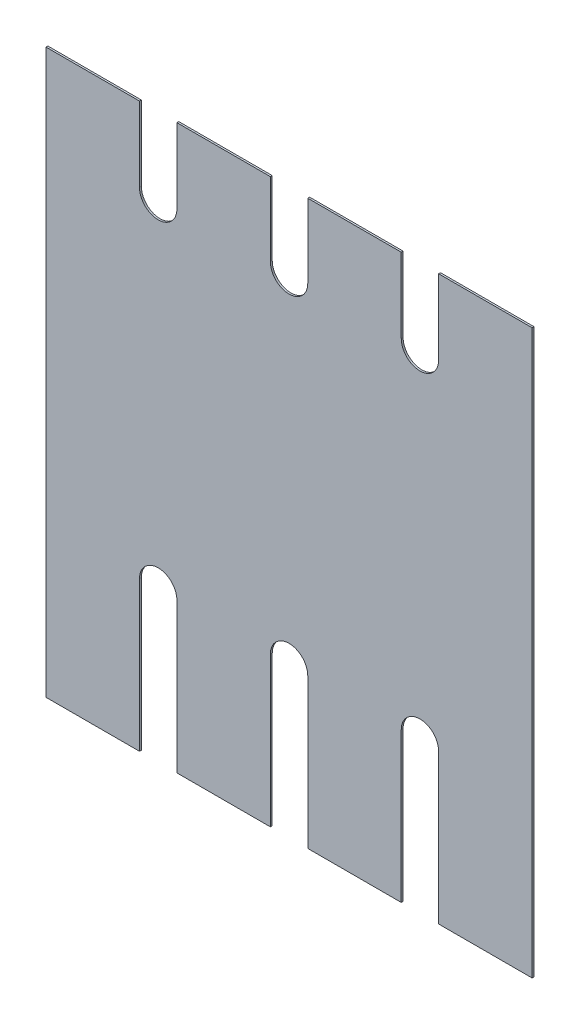
ISO-10303-21;
HEADER;
FILE_DESCRIPTION(('STEP AP214'),'2;1');
FILE_NAME('part.step','',(''),(''),'','','');
FILE_SCHEMA(('AUTOMOTIVE_DESIGN { 1 0 10303 214 1 1 1 1 }'));
ENDSEC;
DATA;
#1=APPLICATION_CONTEXT('core data for automotive mechanical design processes');
#2=APPLICATION_PROTOCOL_DEFINITION('international standard','automotive_design',2000,#1);
#3=PRODUCT_CONTEXT('',#1,'mechanical');
#4=PRODUCT('Part','Part','',(#3));
#5=PRODUCT_RELATED_PRODUCT_CATEGORY('part','',(#4));
#6=PRODUCT_DEFINITION_FORMATION('','',#4);
#7=PRODUCT_DEFINITION_CONTEXT('part definition',#1,'design');
#8=PRODUCT_DEFINITION('design','',#6,#7);
#9=PRODUCT_DEFINITION_SHAPE('','',#8);
#10=(LENGTH_UNIT() NAMED_UNIT(*) SI_UNIT(.MILLI.,.METRE.));
#11=(NAMED_UNIT(*) PLANE_ANGLE_UNIT() SI_UNIT($,.RADIAN.));
#12=(NAMED_UNIT(*) SI_UNIT($,.STERADIAN.) SOLID_ANGLE_UNIT());
#13=UNCERTAINTY_MEASURE_WITH_UNIT(LENGTH_MEASURE(1.E-05),#10,'distance_accuracy_value','');
#14=(GEOMETRIC_REPRESENTATION_CONTEXT(3) GLOBAL_UNCERTAINTY_ASSIGNED_CONTEXT((#13)) GLOBAL_UNIT_ASSIGNED_CONTEXT((#10,
#11,#12)) REPRESENTATION_CONTEXT('',''));
#15=CARTESIAN_POINT('',(0.,0.,0.));
#16=DIRECTION('',(0.,0.,1.));
#17=DIRECTION('',(1.,0.,0.));
#18=AXIS2_PLACEMENT_3D('',#15,#16,#17);
#19=CARTESIAN_POINT('',(1.5,0.,0.025));
#20=DIRECTION('',(-1.,0.,0.));
#21=DIRECTION('',(0.,-1.,0.));
#22=AXIS2_PLACEMENT_3D('',#19,#20,#21);
#23=PLANE('',#22);
#24=DIRECTION('',(0.,1.,0.));
#25=VECTOR('',#24,1.);
#26=CARTESIAN_POINT('',(1.5,0.,0.));
#27=LINE('',#26,#25);
#28=CARTESIAN_POINT('',(1.5,-3.77988348990364,0.));
#29=VERTEX_POINT('',#28);
#30=CARTESIAN_POINT('',(1.5,-1.77988348990364,0.));
#31=VERTEX_POINT('',#30);
#32=EDGE_CURVE('E254',#29,#31,#27,.T.);
#33=ORIENTED_EDGE('',*,*,#32,.T.);
#34=DIRECTION('',(0.,0.,-1.));
#35=VECTOR('',#34,1.);
#36=CARTESIAN_POINT('',(1.5,-1.77988348990364,0.025));
#37=LINE('',#36,#35);
#38=CARTESIAN_POINT('',(1.5,-1.77988348990364,0.025));
#39=VERTEX_POINT('',#38);
#40=EDGE_CURVE('E11',#39,#31,#37,.T.);
#41=ORIENTED_EDGE('',*,*,#40,.F.);
#42=DIRECTION('',(0.,1.,0.));
#43=VECTOR('',#42,1.);
#44=CARTESIAN_POINT('',(1.5,0.,0.025));
#45=LINE('',#44,#43);
#46=CARTESIAN_POINT('',(1.5,-3.77988348990364,0.025));
#47=VERTEX_POINT('',#46);
#48=EDGE_CURVE('E392',#47,#39,#45,.T.);
#49=ORIENTED_EDGE('',*,*,#48,.F.);
#50=DIRECTION('',(0.,0.,-1.));
#51=VECTOR('',#50,1.);
#52=CARTESIAN_POINT('',(1.5,-3.77988348990364,0.025));
#53=LINE('',#52,#51);
#54=EDGE_CURVE('E248',#47,#29,#53,.T.);
#55=ORIENTED_EDGE('',*,*,#54,.T.);
#56=EDGE_LOOP('',(#33,#41,#49,#55));
#57=FACE_BOUND('',#56,.T.);
#58=ADVANCED_FACE('F38',(#57),#23,.F.);
#59=CARTESIAN_POINT('',(1.75,-1.77988348990364,0.025));
#60=DIRECTION('',(0.,0.,-1.));
#61=DIRECTION('',(-1.,0.,0.));
#62=AXIS2_PLACEMENT_3D('',#59,#60,#61);
#63=CYLINDRICAL_SURFACE('',#62,0.249999999999999);
#64=CARTESIAN_POINT('',(1.75,-1.77988348990364,0.));
#65=DIRECTION('',(0.,0.,1.));
#66=DIRECTION('',(1.,0.,0.));
#67=AXIS2_PLACEMENT_3D('',#64,#65,#66);
#68=CIRCLE('',#67,0.249999999999999);
#69=CARTESIAN_POINT('',(2.,-1.77988348990364,0.));
#70=VERTEX_POINT('',#69);
#71=EDGE_CURVE('E257',#31,#70,#68,.F.);
#72=ORIENTED_EDGE('',*,*,#71,.T.);
#73=DIRECTION('',(0.,0.,-1.));
#74=VECTOR('',#73,1.);
#75=CARTESIAN_POINT('',(2.,-1.77988348990364,0.025));
#76=LINE('',#75,#74);
#77=CARTESIAN_POINT('',(2.,-1.77988348990364,0.025));
#78=VERTEX_POINT('',#77);
#79=EDGE_CURVE('E46',#78,#70,#76,.T.);
#80=ORIENTED_EDGE('',*,*,#79,.F.);
#81=CARTESIAN_POINT('',(1.75,-1.77988348990364,0.025));
#82=DIRECTION('',(0.,0.,1.));
#83=DIRECTION('',(1.,0.,0.));
#84=AXIS2_PLACEMENT_3D('',#81,#82,#83);
#85=CIRCLE('',#84,0.249999999999999);
#86=EDGE_CURVE('E153',#39,#78,#85,.F.);
#87=ORIENTED_EDGE('',*,*,#86,.F.);
#88=ORIENTED_EDGE('',*,*,#40,.T.);
#89=EDGE_LOOP('',(#72,#80,#87,#88));
#90=FACE_BOUND('',#89,.T.);
#91=ADVANCED_FACE('F376',(#90),#63,.F.);
#92=CARTESIAN_POINT('',(2.,0.,0.025));
#93=DIRECTION('',(-1.,0.,0.));
#94=DIRECTION('',(0.,-1.,0.));
#95=AXIS2_PLACEMENT_3D('',#92,#93,#94);
#96=PLANE('',#95);
#97=DIRECTION('',(0.,1.,0.));
#98=VECTOR('',#97,1.);
#99=CARTESIAN_POINT('',(2.,0.,0.));
#100=LINE('',#99,#98);
#101=CARTESIAN_POINT('',(2.,-3.77988348990364,0.));
#102=VERTEX_POINT('',#101);
#103=EDGE_CURVE('E260',#102,#70,#100,.T.);
#104=ORIENTED_EDGE('',*,*,#103,.F.);
#105=DIRECTION('',(0.,0.,-1.));
#106=VECTOR('',#105,1.);
#107=CARTESIAN_POINT('',(2.,-3.77988348990364,0.025));
#108=LINE('',#107,#106);
#109=CARTESIAN_POINT('',(2.,-3.77988348990364,0.025));
#110=VERTEX_POINT('',#109);
#111=EDGE_CURVE('E369',#110,#102,#108,.T.);
#112=ORIENTED_EDGE('',*,*,#111,.F.);
#113=DIRECTION('',(0.,1.,0.));
#114=VECTOR('',#113,1.);
#115=CARTESIAN_POINT('',(2.,0.,0.025));
#116=LINE('',#115,#114);
#117=EDGE_CURVE('E375',#110,#78,#116,.T.);
#118=ORIENTED_EDGE('',*,*,#117,.T.);
#119=ORIENTED_EDGE('',*,*,#79,.T.);
#120=EDGE_LOOP('',(#104,#112,#118,#119));
#121=FACE_BOUND('',#120,.T.);
#122=ADVANCED_FACE('F373',(#121),#96,.T.);
#123=CARTESIAN_POINT('',(0.,-3.77988348990364,0.025));
#124=DIRECTION('',(0.,1.,0.));
#125=DIRECTION('',(0.,0.,1.));
#126=AXIS2_PLACEMENT_3D('',#123,#124,#125);
#127=PLANE('',#126);
#128=DIRECTION('',(1.,0.,0.));
#129=VECTOR('',#128,1.);
#130=CARTESIAN_POINT('',(0.,-3.77988348990364,0.));
#131=LINE('',#130,#129);
#132=CARTESIAN_POINT('',(3.25,-3.77988348990364,0.));
#133=VERTEX_POINT('',#132);
#134=EDGE_CURVE('E263',#102,#133,#131,.T.);
#135=ORIENTED_EDGE('',*,*,#134,.T.);
#136=DIRECTION('',(0.,0.,-1.));
#137=VECTOR('',#136,1.);
#138=CARTESIAN_POINT('',(3.25,-3.77988348990364,0.025));
#139=LINE('',#138,#137);
#140=CARTESIAN_POINT('',(3.25,-3.77988348990364,0.025));
#141=VERTEX_POINT('',#140);
#142=EDGE_CURVE('E367',#141,#133,#139,.T.);
#143=ORIENTED_EDGE('',*,*,#142,.F.);
#144=DIRECTION('',(1.,0.,0.));
#145=VECTOR('',#144,1.);
#146=CARTESIAN_POINT('',(0.,-3.77988348990364,0.025));
#147=LINE('',#146,#145);
#148=EDGE_CURVE('E251',#110,#141,#147,.T.);
#149=ORIENTED_EDGE('',*,*,#148,.F.);
#150=ORIENTED_EDGE('',*,*,#111,.T.);
#151=EDGE_LOOP('',(#135,#143,#149,#150));
#152=FACE_BOUND('',#151,.T.);
#153=ADVANCED_FACE('F385',(#152),#127,.F.);
#154=CARTESIAN_POINT('',(3.25,0.,0.025));
#155=DIRECTION('',(1.,0.,0.));
#156=DIRECTION('',(0.,0.,-1.));
#157=AXIS2_PLACEMENT_3D('',#154,#155,#156);
#158=PLANE('',#157);
#159=DIRECTION('',(0.,-1.,0.));
#160=VECTOR('',#159,1.);
#161=CARTESIAN_POINT('',(3.25,0.,0.));
#162=LINE('',#161,#160);
#163=CARTESIAN_POINT('',(3.25,3.75011651009636,0.));
#164=VERTEX_POINT('',#163);
#165=EDGE_CURVE('E266',#164,#133,#162,.T.);
#166=ORIENTED_EDGE('',*,*,#165,.F.);
#167=DIRECTION('',(0.,0.,-1.));
#168=VECTOR('',#167,1.);
#169=CARTESIAN_POINT('',(3.25,3.75011651009636,0.025));
#170=LINE('',#169,#168);
#171=CARTESIAN_POINT('',(3.25,3.75011651009636,0.025));
#172=VERTEX_POINT('',#171);
#173=EDGE_CURVE('E365',#172,#164,#170,.T.);
#174=ORIENTED_EDGE('',*,*,#173,.F.);
#175=DIRECTION('',(0.,-1.,0.));
#176=VECTOR('',#175,1.);
#177=CARTESIAN_POINT('',(3.25,0.,0.025));
#178=LINE('',#177,#176);
#179=EDGE_CURVE('E389',#172,#141,#178,.T.);
#180=ORIENTED_EDGE('',*,*,#179,.T.);
#181=ORIENTED_EDGE('',*,*,#142,.T.);
#182=EDGE_LOOP('',(#166,#174,#180,#181));
#183=FACE_BOUND('',#182,.T.);
#184=ADVANCED_FACE('F477',(#183),#158,.T.);
#185=CARTESIAN_POINT('',(0.,3.75011651009636,0.025));
#186=DIRECTION('',(0.,1.,0.));
#187=DIRECTION('',(0.,0.,1.));
#188=AXIS2_PLACEMENT_3D('',#185,#186,#187);
#189=PLANE('',#188);
#190=DIRECTION('',(1.,0.,0.));
#191=VECTOR('',#190,1.);
#192=CARTESIAN_POINT('',(0.,3.75011651009636,0.));
#193=LINE('',#192,#191);
#194=CARTESIAN_POINT('',(2.,3.75011651009636,0.));
#195=VERTEX_POINT('',#194);
#196=EDGE_CURVE('E270',#195,#164,#193,.T.);
#197=ORIENTED_EDGE('',*,*,#196,.F.);
#198=DIRECTION('',(0.,0.,-1.));
#199=VECTOR('',#198,1.);
#200=CARTESIAN_POINT('',(2.,3.75011651009636,0.025));
#201=LINE('',#200,#199);
#202=CARTESIAN_POINT('',(2.,3.75011651009636,0.025));
#203=VERTEX_POINT('',#202);
#204=EDGE_CURVE('E363',#203,#195,#201,.T.);
#205=ORIENTED_EDGE('',*,*,#204,.F.);
#206=DIRECTION('',(1.,0.,0.));
#207=VECTOR('',#206,1.);
#208=CARTESIAN_POINT('',(0.,3.75011651009636,0.025));
#209=LINE('',#208,#207);
#210=EDGE_CURVE('E397',#203,#172,#209,.T.);
#211=ORIENTED_EDGE('',*,*,#210,.T.);
#212=ORIENTED_EDGE('',*,*,#173,.T.);
#213=EDGE_LOOP('',(#197,#205,#211,#212));
#214=FACE_BOUND('',#213,.T.);
#215=ADVANCED_FACE('F490',(#214),#189,.T.);
#216=CARTESIAN_POINT('',(2.,0.,0.025));
#217=DIRECTION('',(1.,0.,0.));
#218=DIRECTION('',(0.,1.,0.));
#219=AXIS2_PLACEMENT_3D('',#216,#217,#218);
#220=PLANE('',#219);
#221=DIRECTION('',(0.,-1.,0.));
#222=VECTOR('',#221,1.);
#223=CARTESIAN_POINT('',(2.,0.,0.));
#224=LINE('',#223,#222);
#225=CARTESIAN_POINT('',(2.,2.75011651009636,0.));
#226=VERTEX_POINT('',#225);
#227=EDGE_CURVE('E273',#195,#226,#224,.T.);
#228=ORIENTED_EDGE('',*,*,#227,.T.);
#229=DIRECTION('',(0.,0.,-1.));
#230=VECTOR('',#229,1.);
#231=CARTESIAN_POINT('',(2.,2.75011651009636,0.025));
#232=LINE('',#231,#230);
#233=CARTESIAN_POINT('',(2.,2.75011651009636,0.025));
#234=VERTEX_POINT('',#233);
#235=EDGE_CURVE('E360',#234,#226,#232,.T.);
#236=ORIENTED_EDGE('',*,*,#235,.F.);
#237=DIRECTION('',(0.,-1.,0.));
#238=VECTOR('',#237,1.);
#239=CARTESIAN_POINT('',(2.,0.,0.025));
#240=LINE('',#239,#238);
#241=EDGE_CURVE('E400',#203,#234,#240,.T.);
#242=ORIENTED_EDGE('',*,*,#241,.F.);
#243=ORIENTED_EDGE('',*,*,#204,.T.);
#244=EDGE_LOOP('',(#228,#236,#242,#243));
#245=FACE_BOUND('',#244,.T.);
#246=ADVANCED_FACE('F492',(#245),#220,.F.);
#247=CARTESIAN_POINT('',(1.75,2.75011651009636,0.025));
#248=DIRECTION('',(0.,0.,-1.));
#249=DIRECTION('',(-1.,0.,0.));
#250=AXIS2_PLACEMENT_3D('',#247,#248,#249);
#251=CYLINDRICAL_SURFACE('',#250,0.25);
#252=CARTESIAN_POINT('',(1.75,2.75011651009636,0.));
#253=DIRECTION('',(0.,0.,1.));
#254=DIRECTION('',(1.,0.,0.));
#255=AXIS2_PLACEMENT_3D('',#252,#253,#254);
#256=CIRCLE('',#255,0.25);
#257=CARTESIAN_POINT('',(1.5,2.75011651009636,0.));
#258=VERTEX_POINT('',#257);
#259=EDGE_CURVE('E277',#226,#258,#256,.F.);
#260=ORIENTED_EDGE('',*,*,#259,.T.);
#261=DIRECTION('',(0.,0.,-1.));
#262=VECTOR('',#261,1.);
#263=CARTESIAN_POINT('',(1.5,2.75011651009636,0.025));
#264=LINE('',#263,#262);
#265=CARTESIAN_POINT('',(1.5,2.75011651009636,0.025));
#266=VERTEX_POINT('',#265);
#267=EDGE_CURVE('E358',#266,#258,#264,.T.);
#268=ORIENTED_EDGE('',*,*,#267,.F.);
#269=CARTESIAN_POINT('',(1.75,2.75011651009636,0.025));
#270=DIRECTION('',(0.,0.,1.));
#271=DIRECTION('',(1.,0.,0.));
#272=AXIS2_PLACEMENT_3D('',#269,#270,#271);
#273=CIRCLE('',#272,0.25);
#274=EDGE_CURVE('E404',#234,#266,#273,.F.);
#275=ORIENTED_EDGE('',*,*,#274,.F.);
#276=ORIENTED_EDGE('',*,*,#235,.T.);
#277=EDGE_LOOP('',(#260,#268,#275,#276));
#278=FACE_BOUND('',#277,.T.);
#279=ADVANCED_FACE('F495',(#278),#251,.F.);
#280=CARTESIAN_POINT('',(1.5,0.,0.025));
#281=DIRECTION('',(1.,0.,0.));
#282=DIRECTION('',(0.,1.,0.));
#283=AXIS2_PLACEMENT_3D('',#280,#281,#282);
#284=PLANE('',#283);
#285=DIRECTION('',(0.,-1.,0.));
#286=VECTOR('',#285,1.);
#287=CARTESIAN_POINT('',(1.5,0.,0.));
#288=LINE('',#287,#286);
#289=CARTESIAN_POINT('',(1.5,3.75011651009636,0.));
#290=VERTEX_POINT('',#289);
#291=EDGE_CURVE('E280',#290,#258,#288,.T.);
#292=ORIENTED_EDGE('',*,*,#291,.F.);
#293=DIRECTION('',(0.,0.,-1.));
#294=VECTOR('',#293,1.);
#295=CARTESIAN_POINT('',(1.5,3.75011651009636,0.025));
#296=LINE('',#295,#294);
#297=CARTESIAN_POINT('',(1.5,3.75011651009636,0.025));
#298=VERTEX_POINT('',#297);
#299=EDGE_CURVE('E356',#298,#290,#296,.T.);
#300=ORIENTED_EDGE('',*,*,#299,.F.);
#301=DIRECTION('',(0.,-1.,0.));
#302=VECTOR('',#301,1.);
#303=CARTESIAN_POINT('',(1.5,0.,0.025));
#304=LINE('',#303,#302);
#305=EDGE_CURVE('E406',#298,#266,#304,.T.);
#306=ORIENTED_EDGE('',*,*,#305,.T.);
#307=ORIENTED_EDGE('',*,*,#267,.T.);
#308=EDGE_LOOP('',(#292,#300,#306,#307));
#309=FACE_BOUND('',#308,.T.);
#310=ADVANCED_FACE('F499',(#309),#284,.T.);
#311=CARTESIAN_POINT('',(0.25,3.75011651009636,0.));
#312=VERTEX_POINT('',#311);
#313=EDGE_CURVE('E275',#312,#290,#193,.T.);
#314=ORIENTED_EDGE('',*,*,#313,.F.);
#315=DIRECTION('',(0.,0.,-1.));
#316=VECTOR('',#315,1.);
#317=CARTESIAN_POINT('',(0.25,3.75011651009636,0.025));
#318=LINE('',#317,#316);
#319=CARTESIAN_POINT('',(0.25,3.75011651009636,0.025));
#320=VERTEX_POINT('',#319);
#321=EDGE_CURVE('E354',#320,#312,#318,.T.);
#322=ORIENTED_EDGE('',*,*,#321,.F.);
#323=EDGE_CURVE('E402',#320,#298,#209,.T.);
#324=ORIENTED_EDGE('',*,*,#323,.T.);
#325=ORIENTED_EDGE('',*,*,#299,.T.);
#326=EDGE_LOOP('',(#314,#322,#324,#325));
#327=FACE_BOUND('',#326,.T.);
#328=ADVANCED_FACE('F503',(#327),#189,.T.);
#329=CARTESIAN_POINT('',(0.250000000000002,0.,0.025));
#330=DIRECTION('',(1.,0.,0.));
#331=DIRECTION('',(0.,1.,0.));
#332=AXIS2_PLACEMENT_3D('',#329,#330,#331);
#333=PLANE('',#332);
#334=DIRECTION('',(0.,-1.,0.));
#335=VECTOR('',#334,1.);
#336=CARTESIAN_POINT('',(0.250000000000002,0.,0.));
#337=LINE('',#336,#335);
#338=CARTESIAN_POINT('',(0.25,2.765,0.));
#339=VERTEX_POINT('',#338);
#340=EDGE_CURVE('E283',#312,#339,#337,.T.);
#341=ORIENTED_EDGE('',*,*,#340,.T.);
#342=DIRECTION('',(0.,0.,-1.));
#343=VECTOR('',#342,1.);
#344=CARTESIAN_POINT('',(0.25,2.765,0.025));
#345=LINE('',#344,#343);
#346=CARTESIAN_POINT('',(0.25,2.765,0.025));
#347=VERTEX_POINT('',#346);
#348=EDGE_CURVE('E352',#347,#339,#345,.T.);
#349=ORIENTED_EDGE('',*,*,#348,.F.);
#350=DIRECTION('',(0.,-1.,0.));
#351=VECTOR('',#350,1.);
#352=CARTESIAN_POINT('',(0.250000000000002,0.,0.025));
#353=LINE('',#352,#351);
#354=EDGE_CURVE('E409',#320,#347,#353,.T.);
#355=ORIENTED_EDGE('',*,*,#354,.F.);
#356=ORIENTED_EDGE('',*,*,#321,.T.);
#357=EDGE_LOOP('',(#341,#349,#355,#356));
#358=FACE_BOUND('',#357,.T.);
#359=ADVANCED_FACE('F505',(#358),#333,.F.);
#360=CARTESIAN_POINT('',(0.,2.765,0.025));
#361=DIRECTION('',(0.,0.,-1.));
#362=DIRECTION('',(-1.,0.,0.));
#363=AXIS2_PLACEMENT_3D('',#360,#361,#362);
#364=CYLINDRICAL_SURFACE('',#363,0.25);
#365=CARTESIAN_POINT('',(0.,2.765,0.));
#366=DIRECTION('',(0.,0.,1.));
#367=DIRECTION('',(1.,0.,0.));
#368=AXIS2_PLACEMENT_3D('',#365,#366,#367);
#369=CIRCLE('',#368,0.25);
#370=CARTESIAN_POINT('',(-0.25,2.765,0.));
#371=VERTEX_POINT('',#370);
#372=EDGE_CURVE('E286',#371,#339,#369,.T.);
#373=ORIENTED_EDGE('',*,*,#372,.F.);
#374=DIRECTION('',(0.,0.,-1.));
#375=VECTOR('',#374,1.);
#376=CARTESIAN_POINT('',(-0.25,2.765,0.025));
#377=LINE('',#376,#375);
#378=CARTESIAN_POINT('',(-0.25,2.765,0.025));
#379=VERTEX_POINT('',#378);
#380=EDGE_CURVE('E350',#379,#371,#377,.T.);
#381=ORIENTED_EDGE('',*,*,#380,.F.);
#382=CARTESIAN_POINT('',(0.,2.765,0.025));
#383=DIRECTION('',(0.,0.,1.));
#384=DIRECTION('',(1.,0.,0.));
#385=AXIS2_PLACEMENT_3D('',#382,#383,#384);
#386=CIRCLE('',#385,0.25);
#387=EDGE_CURVE('E411',#379,#347,#386,.T.);
#388=ORIENTED_EDGE('',*,*,#387,.T.);
#389=ORIENTED_EDGE('',*,*,#348,.T.);
#390=EDGE_LOOP('',(#373,#381,#388,#389));
#391=FACE_BOUND('',#390,.T.);
#392=ADVANCED_FACE('F508',(#391),#364,.F.);
#393=CARTESIAN_POINT('',(-0.250000000000002,0.,0.025));
#394=DIRECTION('',(1.,0.,0.));
#395=DIRECTION('',(0.,1.,0.));
#396=AXIS2_PLACEMENT_3D('',#393,#394,#395);
#397=PLANE('',#396);
#398=DIRECTION('',(0.,-1.,0.));
#399=VECTOR('',#398,1.);
#400=CARTESIAN_POINT('',(-0.250000000000002,0.,0.));
#401=LINE('',#400,#399);
#402=CARTESIAN_POINT('',(-0.25,3.75011651009636,0.));
#403=VERTEX_POINT('',#402);
#404=EDGE_CURVE('E289',#403,#371,#401,.T.);
#405=ORIENTED_EDGE('',*,*,#404,.F.);
#406=DIRECTION('',(0.,0.,-1.));
#407=VECTOR('',#406,1.);
#408=CARTESIAN_POINT('',(-0.25,3.75011651009636,0.025));
#409=LINE('',#408,#407);
#410=CARTESIAN_POINT('',(-0.25,3.75011651009636,0.025));
#411=VERTEX_POINT('',#410);
#412=EDGE_CURVE('E348',#411,#403,#409,.T.);
#413=ORIENTED_EDGE('',*,*,#412,.F.);
#414=DIRECTION('',(0.,-1.,0.));
#415=VECTOR('',#414,1.);
#416=CARTESIAN_POINT('',(-0.250000000000002,0.,0.025));
#417=LINE('',#416,#415);
#418=EDGE_CURVE('E414',#411,#379,#417,.T.);
#419=ORIENTED_EDGE('',*,*,#418,.T.);
#420=ORIENTED_EDGE('',*,*,#380,.T.);
#421=EDGE_LOOP('',(#405,#413,#419,#420));
#422=FACE_BOUND('',#421,.T.);
#423=ADVANCED_FACE('F512',(#422),#397,.T.);
#424=CARTESIAN_POINT('',(-1.5,3.75011651009636,0.));
#425=VERTEX_POINT('',#424);
#426=EDGE_CURVE('E292',#425,#403,#193,.T.);
#427=ORIENTED_EDGE('',*,*,#426,.F.);
#428=DIRECTION('',(0.,0.,-1.));
#429=VECTOR('',#428,1.);
#430=CARTESIAN_POINT('',(-1.5,3.75011651009636,0.025));
#431=LINE('',#430,#429);
#432=CARTESIAN_POINT('',(-1.5,3.75011651009636,0.025));
#433=VERTEX_POINT('',#432);
#434=EDGE_CURVE('E346',#433,#425,#431,.T.);
#435=ORIENTED_EDGE('',*,*,#434,.F.);
#436=EDGE_CURVE('E417',#433,#411,#209,.T.);
#437=ORIENTED_EDGE('',*,*,#436,.T.);
#438=ORIENTED_EDGE('',*,*,#412,.T.);
#439=EDGE_LOOP('',(#427,#435,#437,#438));
#440=FACE_BOUND('',#439,.T.);
#441=ADVANCED_FACE('F516',(#440),#189,.T.);
#442=CARTESIAN_POINT('',(-1.5,0.,0.025));
#443=DIRECTION('',(1.,0.,0.));
#444=DIRECTION('',(0.,1.,0.));
#445=AXIS2_PLACEMENT_3D('',#442,#443,#444);
#446=PLANE('',#445);
#447=DIRECTION('',(0.,-1.,0.));
#448=VECTOR('',#447,1.);
#449=CARTESIAN_POINT('',(-1.5,0.,0.));
#450=LINE('',#449,#448);
#451=CARTESIAN_POINT('',(-1.5,2.75011651009636,0.));
#452=VERTEX_POINT('',#451);
#453=EDGE_CURVE('E293',#425,#452,#450,.T.);
#454=ORIENTED_EDGE('',*,*,#453,.T.);
#455=DIRECTION('',(0.,0.,-1.));
#456=VECTOR('',#455,1.);
#457=CARTESIAN_POINT('',(-1.5,2.75011651009636,0.025));
#458=LINE('',#457,#456);
#459=CARTESIAN_POINT('',(-1.5,2.75011651009636,0.025));
#460=VERTEX_POINT('',#459);
#461=EDGE_CURVE('E344',#460,#452,#458,.T.);
#462=ORIENTED_EDGE('',*,*,#461,.F.);
#463=DIRECTION('',(0.,-1.,0.));
#464=VECTOR('',#463,1.);
#465=CARTESIAN_POINT('',(-1.5,0.,0.025));
#466=LINE('',#465,#464);
#467=EDGE_CURVE('E418',#433,#460,#466,.T.);
#468=ORIENTED_EDGE('',*,*,#467,.F.);
#469=ORIENTED_EDGE('',*,*,#434,.T.);
#470=EDGE_LOOP('',(#454,#462,#468,#469));
#471=FACE_BOUND('',#470,.T.);
#472=ADVANCED_FACE('F518',(#471),#446,.F.);
#473=CARTESIAN_POINT('',(-1.75,2.75011651009636,0.025));
#474=DIRECTION('',(0.,0.,-1.));
#475=DIRECTION('',(-1.,0.,0.));
#476=AXIS2_PLACEMENT_3D('',#473,#474,#475);
#477=CYLINDRICAL_SURFACE('',#476,0.25);
#478=CARTESIAN_POINT('',(-1.75,2.75011651009636,0.));
#479=DIRECTION('',(0.,0.,1.));
#480=DIRECTION('',(1.,0.,0.));
#481=AXIS2_PLACEMENT_3D('',#478,#479,#480);
#482=CIRCLE('',#481,0.25);
#483=CARTESIAN_POINT('',(-2.,2.75011651009636,0.));
#484=VERTEX_POINT('',#483);
#485=EDGE_CURVE('E296',#484,#452,#482,.T.);
#486=ORIENTED_EDGE('',*,*,#485,.F.);
#487=DIRECTION('',(0.,0.,-1.));
#488=VECTOR('',#487,1.);
#489=CARTESIAN_POINT('',(-2.,2.75011651009636,0.025));
#490=LINE('',#489,#488);
#491=CARTESIAN_POINT('',(-2.,2.75011651009636,0.025));
#492=VERTEX_POINT('',#491);
#493=EDGE_CURVE('E342',#492,#484,#490,.T.);
#494=ORIENTED_EDGE('',*,*,#493,.F.);
#495=CARTESIAN_POINT('',(-1.75,2.75011651009636,0.025));
#496=DIRECTION('',(0.,0.,1.));
#497=DIRECTION('',(1.,0.,0.));
#498=AXIS2_PLACEMENT_3D('',#495,#496,#497);
#499=CIRCLE('',#498,0.25);
#500=EDGE_CURVE('E420',#492,#460,#499,.T.);
#501=ORIENTED_EDGE('',*,*,#500,.T.);
#502=ORIENTED_EDGE('',*,*,#461,.T.);
#503=EDGE_LOOP('',(#486,#494,#501,#502));
#504=FACE_BOUND('',#503,.T.);
#505=ADVANCED_FACE('F521',(#504),#477,.F.);
#506=CARTESIAN_POINT('',(-2.,0.,0.025));
#507=DIRECTION('',(1.,0.,0.));
#508=DIRECTION('',(0.,1.,0.));
#509=AXIS2_PLACEMENT_3D('',#506,#507,#508);
#510=PLANE('',#509);
#511=DIRECTION('',(0.,-1.,0.));
#512=VECTOR('',#511,1.);
#513=CARTESIAN_POINT('',(-2.,0.,0.));
#514=LINE('',#513,#512);
#515=CARTESIAN_POINT('',(-2.,3.75011651009636,0.));
#516=VERTEX_POINT('',#515);
#517=EDGE_CURVE('E299',#516,#484,#514,.T.);
#518=ORIENTED_EDGE('',*,*,#517,.F.);
#519=DIRECTION('',(0.,0.,-1.));
#520=VECTOR('',#519,1.);
#521=CARTESIAN_POINT('',(-2.,3.75011651009636,0.025));
#522=LINE('',#521,#520);
#523=CARTESIAN_POINT('',(-2.,3.75011651009636,0.025));
#524=VERTEX_POINT('',#523);
#525=EDGE_CURVE('E340',#524,#516,#522,.T.);
#526=ORIENTED_EDGE('',*,*,#525,.F.);
#527=DIRECTION('',(0.,-1.,0.));
#528=VECTOR('',#527,1.);
#529=CARTESIAN_POINT('',(-2.,0.,0.025));
#530=LINE('',#529,#528);
#531=EDGE_CURVE('E423',#524,#492,#530,.T.);
#532=ORIENTED_EDGE('',*,*,#531,.T.);
#533=ORIENTED_EDGE('',*,*,#493,.T.);
#534=EDGE_LOOP('',(#518,#526,#532,#533));
#535=FACE_BOUND('',#534,.T.);
#536=ADVANCED_FACE('F525',(#535),#510,.T.);
#537=CARTESIAN_POINT('',(-3.25,3.75011651009636,0.));
#538=VERTEX_POINT('',#537);
#539=EDGE_CURVE('E274',#538,#516,#193,.T.);
#540=ORIENTED_EDGE('',*,*,#539,.F.);
#541=DIRECTION('',(0.,0.,-1.));
#542=VECTOR('',#541,1.);
#543=CARTESIAN_POINT('',(-3.25,3.75011651009636,0.025));
#544=LINE('',#543,#542);
#545=CARTESIAN_POINT('',(-3.25,3.75011651009636,0.025));
#546=VERTEX_POINT('',#545);
#547=EDGE_CURVE('E338',#546,#538,#544,.T.);
#548=ORIENTED_EDGE('',*,*,#547,.F.);
#549=EDGE_CURVE('E401',#546,#524,#209,.T.);
#550=ORIENTED_EDGE('',*,*,#549,.T.);
#551=ORIENTED_EDGE('',*,*,#525,.T.);
#552=EDGE_LOOP('',(#540,#548,#550,#551));
#553=FACE_BOUND('',#552,.T.);
#554=ADVANCED_FACE('F529',(#553),#189,.T.);
#555=CARTESIAN_POINT('',(-3.25,0.,0.025));
#556=DIRECTION('',(1.,0.,0.));
#557=DIRECTION('',(0.,0.,-1.));
#558=AXIS2_PLACEMENT_3D('',#555,#556,#557);
#559=PLANE('',#558);
#560=DIRECTION('',(0.,-1.,0.));
#561=VECTOR('',#560,1.);
#562=CARTESIAN_POINT('',(-3.25,0.,0.));
#563=LINE('',#562,#561);
#564=CARTESIAN_POINT('',(-3.25,-3.77988348990364,0.));
#565=VERTEX_POINT('',#564);
#566=EDGE_CURVE('E302',#538,#565,#563,.T.);
#567=ORIENTED_EDGE('',*,*,#566,.T.);
#568=DIRECTION('',(0.,0.,-1.));
#569=VECTOR('',#568,1.);
#570=CARTESIAN_POINT('',(-3.25,-3.77988348990364,0.025));
#571=LINE('',#570,#569);
#572=CARTESIAN_POINT('',(-3.25,-3.77988348990364,0.025));
#573=VERTEX_POINT('',#572);
#574=EDGE_CURVE('E335',#573,#565,#571,.T.);
#575=ORIENTED_EDGE('',*,*,#574,.F.);
#576=DIRECTION('',(0.,-1.,0.));
#577=VECTOR('',#576,1.);
#578=CARTESIAN_POINT('',(-3.25,0.,0.025));
#579=LINE('',#578,#577);
#580=EDGE_CURVE('E426',#546,#573,#579,.T.);
#581=ORIENTED_EDGE('',*,*,#580,.F.);
#582=ORIENTED_EDGE('',*,*,#547,.T.);
#583=EDGE_LOOP('',(#567,#575,#581,#582));
#584=FACE_BOUND('',#583,.T.);
#585=ADVANCED_FACE('F533',(#584),#559,.F.);
#586=CARTESIAN_POINT('',(-2.,-3.77988348990364,0.));
#587=VERTEX_POINT('',#586);
#588=EDGE_CURVE('E267',#565,#587,#131,.T.);
#589=ORIENTED_EDGE('',*,*,#588,.T.);
#590=DIRECTION('',(0.,0.,-1.));
#591=VECTOR('',#590,1.);
#592=CARTESIAN_POINT('',(-2.,-3.77988348990364,0.025));
#593=LINE('',#592,#591);
#594=CARTESIAN_POINT('',(-2.,-3.77988348990364,0.025));
#595=VERTEX_POINT('',#594);
#596=EDGE_CURVE('E332',#595,#587,#593,.T.);
#597=ORIENTED_EDGE('',*,*,#596,.F.);
#598=EDGE_CURVE('E390',#573,#595,#147,.T.);
#599=ORIENTED_EDGE('',*,*,#598,.F.);
#600=ORIENTED_EDGE('',*,*,#574,.T.);
#601=EDGE_LOOP('',(#589,#597,#599,#600));
#602=FACE_BOUND('',#601,.T.);
#603=ADVANCED_FACE('F447',(#602),#127,.F.);
#604=CARTESIAN_POINT('',(-2.,0.,0.025));
#605=DIRECTION('',(-1.,0.,0.));
#606=DIRECTION('',(0.,-1.,0.));
#607=AXIS2_PLACEMENT_3D('',#604,#605,#606);
#608=PLANE('',#607);
#609=DIRECTION('',(0.,1.,0.));
#610=VECTOR('',#609,1.);
#611=CARTESIAN_POINT('',(-2.,0.,0.));
#612=LINE('',#611,#610);
#613=CARTESIAN_POINT('',(-2.,-1.77988348990364,0.));
#614=VERTEX_POINT('',#613);
#615=EDGE_CURVE('E304',#587,#614,#612,.T.);
#616=ORIENTED_EDGE('',*,*,#615,.T.);
#617=DIRECTION('',(0.,0.,-1.));
#618=VECTOR('',#617,1.);
#619=CARTESIAN_POINT('',(-2.,-1.77988348990364,0.025));
#620=LINE('',#619,#618);
#621=CARTESIAN_POINT('',(-2.,-1.77988348990364,0.025));
#622=VERTEX_POINT('',#621);
#623=EDGE_CURVE('E330',#622,#614,#620,.T.);
#624=ORIENTED_EDGE('',*,*,#623,.F.);
#625=DIRECTION('',(0.,1.,0.));
#626=VECTOR('',#625,1.);
#627=CARTESIAN_POINT('',(-2.,0.,0.025));
#628=LINE('',#627,#626);
#629=EDGE_CURVE('E428',#595,#622,#628,.T.);
#630=ORIENTED_EDGE('',*,*,#629,.F.);
#631=ORIENTED_EDGE('',*,*,#596,.T.);
#632=EDGE_LOOP('',(#616,#624,#630,#631));
#633=FACE_BOUND('',#632,.T.);
#634=ADVANCED_FACE('F451',(#633),#608,.F.);
#635=CARTESIAN_POINT('',(-1.75,-1.77988348990364,0.025));
#636=DIRECTION('',(0.,0.,-1.));
#637=DIRECTION('',(-1.,0.,0.));
#638=AXIS2_PLACEMENT_3D('',#635,#636,#637);
#639=CYLINDRICAL_SURFACE('',#638,0.249999999999999);
#640=CARTESIAN_POINT('',(-1.75,-1.77988348990364,0.));
#641=DIRECTION('',(0.,0.,1.));
#642=DIRECTION('',(1.,0.,0.));
#643=AXIS2_PLACEMENT_3D('',#640,#641,#642);
#644=CIRCLE('',#643,0.249999999999999);
#645=CARTESIAN_POINT('',(-1.5,-1.77988348990364,0.));
#646=VERTEX_POINT('',#645);
#647=EDGE_CURVE('E307',#646,#614,#644,.T.);
#648=ORIENTED_EDGE('',*,*,#647,.F.);
#649=DIRECTION('',(0.,0.,-1.));
#650=VECTOR('',#649,1.);
#651=CARTESIAN_POINT('',(-1.5,-1.77988348990364,0.025));
#652=LINE('',#651,#650);
#653=CARTESIAN_POINT('',(-1.5,-1.77988348990364,0.025));
#654=VERTEX_POINT('',#653);
#655=EDGE_CURVE('E328',#654,#646,#652,.T.);
#656=ORIENTED_EDGE('',*,*,#655,.F.);
#657=CARTESIAN_POINT('',(-1.75,-1.77988348990364,0.025));
#658=DIRECTION('',(0.,0.,1.));
#659=DIRECTION('',(1.,0.,0.));
#660=AXIS2_PLACEMENT_3D('',#657,#658,#659);
#661=CIRCLE('',#660,0.249999999999999);
#662=EDGE_CURVE('E430',#654,#622,#661,.T.);
#663=ORIENTED_EDGE('',*,*,#662,.T.);
#664=ORIENTED_EDGE('',*,*,#623,.T.);
#665=EDGE_LOOP('',(#648,#656,#663,#664));
#666=FACE_BOUND('',#665,.T.);
#667=ADVANCED_FACE('F454',(#666),#639,.F.);
#668=CARTESIAN_POINT('',(-1.5,0.,0.025));
#669=DIRECTION('',(-1.,0.,0.));
#670=DIRECTION('',(0.,-1.,0.));
#671=AXIS2_PLACEMENT_3D('',#668,#669,#670);
#672=PLANE('',#671);
#673=DIRECTION('',(0.,1.,0.));
#674=VECTOR('',#673,1.);
#675=CARTESIAN_POINT('',(-1.5,0.,0.));
#676=LINE('',#675,#674);
#677=CARTESIAN_POINT('',(-1.5,-3.77988348990364,0.));
#678=VERTEX_POINT('',#677);
#679=EDGE_CURVE('E310',#678,#646,#676,.T.);
#680=ORIENTED_EDGE('',*,*,#679,.F.);
#681=DIRECTION('',(0.,0.,-1.));
#682=VECTOR('',#681,1.);
#683=CARTESIAN_POINT('',(-1.5,-3.77988348990364,0.025));
#684=LINE('',#683,#682);
#685=CARTESIAN_POINT('',(-1.5,-3.77988348990364,0.025));
#686=VERTEX_POINT('',#685);
#687=EDGE_CURVE('E326',#686,#678,#684,.T.);
#688=ORIENTED_EDGE('',*,*,#687,.F.);
#689=DIRECTION('',(0.,1.,0.));
#690=VECTOR('',#689,1.);
#691=CARTESIAN_POINT('',(-1.5,0.,0.025));
#692=LINE('',#691,#690);
#693=EDGE_CURVE('E433',#686,#654,#692,.T.);
#694=ORIENTED_EDGE('',*,*,#693,.T.);
#695=ORIENTED_EDGE('',*,*,#655,.T.);
#696=EDGE_LOOP('',(#680,#688,#694,#695));
#697=FACE_BOUND('',#696,.T.);
#698=ADVANCED_FACE('F457',(#697),#672,.T.);
#699=CARTESIAN_POINT('',(-0.25,-3.77988348990364,0.));
#700=VERTEX_POINT('',#699);
#701=EDGE_CURVE('E313',#678,#700,#131,.T.);
#702=ORIENTED_EDGE('',*,*,#701,.T.);
#703=DIRECTION('',(0.,0.,-1.));
#704=VECTOR('',#703,1.);
#705=CARTESIAN_POINT('',(-0.25,-3.77988348990364,0.025));
#706=LINE('',#705,#704);
#707=CARTESIAN_POINT('',(-0.25,-3.77988348990364,0.025));
#708=VERTEX_POINT('',#707);
#709=EDGE_CURVE('E323',#708,#700,#706,.T.);
#710=ORIENTED_EDGE('',*,*,#709,.F.);
#711=EDGE_CURVE('E250',#686,#708,#147,.T.);
#712=ORIENTED_EDGE('',*,*,#711,.F.);
#713=ORIENTED_EDGE('',*,*,#687,.T.);
#714=EDGE_LOOP('',(#702,#710,#712,#713));
#715=FACE_BOUND('',#714,.T.);
#716=ADVANCED_FACE('F460',(#715),#127,.F.);
#717=CARTESIAN_POINT('',(-0.249999999999999,0.,0.025));
#718=DIRECTION('',(-1.,0.,0.));
#719=DIRECTION('',(0.,-1.,0.));
#720=AXIS2_PLACEMENT_3D('',#717,#718,#719);
#721=PLANE('',#720);
#722=DIRECTION('',(0.,1.,0.));
#723=VECTOR('',#722,1.);
#724=CARTESIAN_POINT('',(-0.249999999999999,0.,0.));
#725=LINE('',#724,#723);
#726=CARTESIAN_POINT('',(-0.25,-1.77988348990364,0.));
#727=VERTEX_POINT('',#726);
#728=EDGE_CURVE('E314',#700,#727,#725,.T.);
#729=ORIENTED_EDGE('',*,*,#728,.T.);
#730=DIRECTION('',(0.,0.,-1.));
#731=VECTOR('',#730,1.);
#732=CARTESIAN_POINT('',(-0.25,-1.77988348990364,0.025));
#733=LINE('',#732,#731);
#734=CARTESIAN_POINT('',(-0.25,-1.77988348990364,0.025));
#735=VERTEX_POINT('',#734);
#736=EDGE_CURVE('E238',#735,#727,#733,.T.);
#737=ORIENTED_EDGE('',*,*,#736,.F.);
#738=DIRECTION('',(0.,1.,0.));
#739=VECTOR('',#738,1.);
#740=CARTESIAN_POINT('',(-0.249999999999999,0.,0.025));
#741=LINE('',#740,#739);
#742=EDGE_CURVE('E243',#708,#735,#741,.T.);
#743=ORIENTED_EDGE('',*,*,#742,.F.);
#744=ORIENTED_EDGE('',*,*,#709,.T.);
#745=EDGE_LOOP('',(#729,#737,#743,#744));
#746=FACE_BOUND('',#745,.T.);
#747=ADVANCED_FACE('F463',(#746),#721,.F.);
#748=CARTESIAN_POINT('',(0.,-1.77988348990364,0.025));
#749=DIRECTION('',(0.,0.,-1.));
#750=DIRECTION('',(-1.,0.,0.));
#751=AXIS2_PLACEMENT_3D('',#748,#749,#750);
#752=CYLINDRICAL_SURFACE('',#751,0.25);
#753=CARTESIAN_POINT('',(0.,-1.77988348990364,0.));
#754=DIRECTION('',(0.,0.,1.));
#755=DIRECTION('',(1.,0.,0.));
#756=AXIS2_PLACEMENT_3D('',#753,#754,#755);
#757=CIRCLE('',#756,0.25);
#758=CARTESIAN_POINT('',(0.25,-1.77988348990364,0.));
#759=VERTEX_POINT('',#758);
#760=EDGE_CURVE('E233',#759,#727,#757,.T.);
#761=ORIENTED_EDGE('',*,*,#760,.F.);
#762=DIRECTION('',(0.,0.,-1.));
#763=VECTOR('',#762,1.);
#764=CARTESIAN_POINT('',(0.25,-1.77988348990364,0.025));
#765=LINE('',#764,#763);
#766=CARTESIAN_POINT('',(0.25,-1.77988348990364,0.025));
#767=VERTEX_POINT('',#766);
#768=EDGE_CURVE('E228',#767,#759,#765,.T.);
#769=ORIENTED_EDGE('',*,*,#768,.F.);
#770=CARTESIAN_POINT('',(0.,-1.77988348990364,0.025));
#771=DIRECTION('',(0.,0.,1.));
#772=DIRECTION('',(1.,0.,0.));
#773=AXIS2_PLACEMENT_3D('',#770,#771,#772);
#774=CIRCLE('',#773,0.25);
#775=EDGE_CURVE('E231',#767,#735,#774,.T.);
#776=ORIENTED_EDGE('',*,*,#775,.T.);
#777=ORIENTED_EDGE('',*,*,#736,.T.);
#778=EDGE_LOOP('',(#761,#769,#776,#777));
#779=FACE_BOUND('',#778,.T.);
#780=ADVANCED_FACE('F230',(#779),#752,.F.);
#781=CARTESIAN_POINT('',(0.250000000000001,0.,0.025));
#782=DIRECTION('',(-1.,0.,0.));
#783=DIRECTION('',(0.,-1.,0.));
#784=AXIS2_PLACEMENT_3D('',#781,#782,#783);
#785=PLANE('',#784);
#786=DIRECTION('',(0.,1.,0.));
#787=VECTOR('',#786,1.);
#788=CARTESIAN_POINT('',(0.250000000000001,0.,0.));
#789=LINE('',#788,#787);
#790=CARTESIAN_POINT('',(0.25,-3.77988348990364,0.));
#791=VERTEX_POINT('',#790);
#792=EDGE_CURVE('E318',#791,#759,#789,.T.);
#793=ORIENTED_EDGE('',*,*,#792,.F.);
#794=DIRECTION('',(0.,0.,-1.));
#795=VECTOR('',#794,1.);
#796=CARTESIAN_POINT('',(0.25,-3.77988348990364,0.025));
#797=LINE('',#796,#795);
#798=CARTESIAN_POINT('',(0.25,-3.77988348990364,0.025));
#799=VERTEX_POINT('',#798);
#800=EDGE_CURVE('E142',#799,#791,#797,.T.);
#801=ORIENTED_EDGE('',*,*,#800,.F.);
#802=DIRECTION('',(0.,1.,0.));
#803=VECTOR('',#802,1.);
#804=CARTESIAN_POINT('',(0.250000000000001,0.,0.025));
#805=LINE('',#804,#803);
#806=EDGE_CURVE('E241',#799,#767,#805,.T.);
#807=ORIENTED_EDGE('',*,*,#806,.T.);
#808=ORIENTED_EDGE('',*,*,#768,.T.);
#809=EDGE_LOOP('',(#793,#801,#807,#808));
#810=FACE_BOUND('',#809,.T.);
#811=ADVANCED_FACE('F246',(#810),#785,.T.);
#812=EDGE_CURVE('E145',#791,#29,#131,.T.);
#813=ORIENTED_EDGE('',*,*,#812,.T.);
#814=ORIENTED_EDGE('',*,*,#54,.F.);
#815=EDGE_CURVE('E54',#799,#47,#147,.T.);
#816=ORIENTED_EDGE('',*,*,#815,.F.);
#817=ORIENTED_EDGE('',*,*,#800,.T.);
#818=EDGE_LOOP('',(#813,#814,#816,#817));
#819=FACE_BOUND('',#818,.T.);
#820=ADVANCED_FACE('F466',(#819),#127,.F.);
#821=CARTESIAN_POINT('',(0.,0.,0.025));
#822=DIRECTION('',(0.,0.,1.));
#823=DIRECTION('',(1.,0.,0.));
#824=AXIS2_PLACEMENT_3D('',#821,#822,#823);
#825=PLANE('',#824);
#826=ORIENTED_EDGE('',*,*,#48,.T.);
#827=ORIENTED_EDGE('',*,*,#86,.T.);
#828=ORIENTED_EDGE('',*,*,#117,.F.);
#829=ORIENTED_EDGE('',*,*,#148,.T.);
#830=ORIENTED_EDGE('',*,*,#179,.F.);
#831=ORIENTED_EDGE('',*,*,#210,.F.);
#832=ORIENTED_EDGE('',*,*,#241,.T.);
#833=ORIENTED_EDGE('',*,*,#274,.T.);
#834=ORIENTED_EDGE('',*,*,#305,.F.);
#835=ORIENTED_EDGE('',*,*,#323,.F.);
#836=ORIENTED_EDGE('',*,*,#354,.T.);
#837=ORIENTED_EDGE('',*,*,#387,.F.);
#838=ORIENTED_EDGE('',*,*,#418,.F.);
#839=ORIENTED_EDGE('',*,*,#436,.F.);
#840=ORIENTED_EDGE('',*,*,#467,.T.);
#841=ORIENTED_EDGE('',*,*,#500,.F.);
#842=ORIENTED_EDGE('',*,*,#531,.F.);
#843=ORIENTED_EDGE('',*,*,#549,.F.);
#844=ORIENTED_EDGE('',*,*,#580,.T.);
#845=ORIENTED_EDGE('',*,*,#598,.T.);
#846=ORIENTED_EDGE('',*,*,#629,.T.);
#847=ORIENTED_EDGE('',*,*,#662,.F.);
#848=ORIENTED_EDGE('',*,*,#693,.F.);
#849=ORIENTED_EDGE('',*,*,#711,.T.);
#850=ORIENTED_EDGE('',*,*,#742,.T.);
#851=ORIENTED_EDGE('',*,*,#775,.F.);
#852=ORIENTED_EDGE('',*,*,#806,.F.);
#853=ORIENTED_EDGE('',*,*,#815,.T.);
#854=EDGE_LOOP('',(#826,#827,#828,#829,#830,#831,#832,#833,#834,#835,#836,#837,#838,#839,#840,
#841,#842,#843,#844,#845,#846,#847,#848,#849,#850,#851,#852,#853));
#855=FACE_BOUND('',#854,.T.);
#856=ADVANCED_FACE('F240',(#855),#825,.T.);
#857=CARTESIAN_POINT('',(0.,0.,0.));
#858=DIRECTION('',(0.,0.,1.));
#859=DIRECTION('',(1.,0.,0.));
#860=AXIS2_PLACEMENT_3D('',#857,#858,#859);
#861=PLANE('',#860);
#862=ORIENTED_EDGE('',*,*,#32,.F.);
#863=ORIENTED_EDGE('',*,*,#812,.F.);
#864=ORIENTED_EDGE('',*,*,#792,.T.);
#865=ORIENTED_EDGE('',*,*,#760,.T.);
#866=ORIENTED_EDGE('',*,*,#728,.F.);
#867=ORIENTED_EDGE('',*,*,#701,.F.);
#868=ORIENTED_EDGE('',*,*,#679,.T.);
#869=ORIENTED_EDGE('',*,*,#647,.T.);
#870=ORIENTED_EDGE('',*,*,#615,.F.);
#871=ORIENTED_EDGE('',*,*,#588,.F.);
#872=ORIENTED_EDGE('',*,*,#566,.F.);
#873=ORIENTED_EDGE('',*,*,#539,.T.);
#874=ORIENTED_EDGE('',*,*,#517,.T.);
#875=ORIENTED_EDGE('',*,*,#485,.T.);
#876=ORIENTED_EDGE('',*,*,#453,.F.);
#877=ORIENTED_EDGE('',*,*,#426,.T.);
#878=ORIENTED_EDGE('',*,*,#404,.T.);
#879=ORIENTED_EDGE('',*,*,#372,.T.);
#880=ORIENTED_EDGE('',*,*,#340,.F.);
#881=ORIENTED_EDGE('',*,*,#313,.T.);
#882=ORIENTED_EDGE('',*,*,#291,.T.);
#883=ORIENTED_EDGE('',*,*,#259,.F.);
#884=ORIENTED_EDGE('',*,*,#227,.F.);
#885=ORIENTED_EDGE('',*,*,#196,.T.);
#886=ORIENTED_EDGE('',*,*,#165,.T.);
#887=ORIENTED_EDGE('',*,*,#134,.F.);
#888=ORIENTED_EDGE('',*,*,#103,.T.);
#889=ORIENTED_EDGE('',*,*,#71,.F.);
#890=EDGE_LOOP('',(#862,#863,#864,#865,#866,#867,#868,#869,#870,#871,#872,#873,#874,#875,#876,
#877,#878,#879,#880,#881,#882,#883,#884,#885,#886,#887,#888,#889));
#891=FACE_BOUND('',#890,.T.);
#892=ADVANCED_FACE('F381',(#891),#861,.F.);
#893=CLOSED_SHELL('',(#58,#91,#122,#153,#184,#215,#246,#279,#310,#328,#359,#392,#423,#441,#472,
#505,#536,#554,#585,#603,#634,#667,#698,#716,#747,#780,#811,#820,#856,#892));
#894=MANIFOLD_SOLID_BREP('B2',#893);
#895=ADVANCED_BREP_SHAPE_REPRESENTATION('',(#18,#894),#14);
#896=SHAPE_DEFINITION_REPRESENTATION(#9,#895);
ENDSEC;
END-ISO-10303-21;
